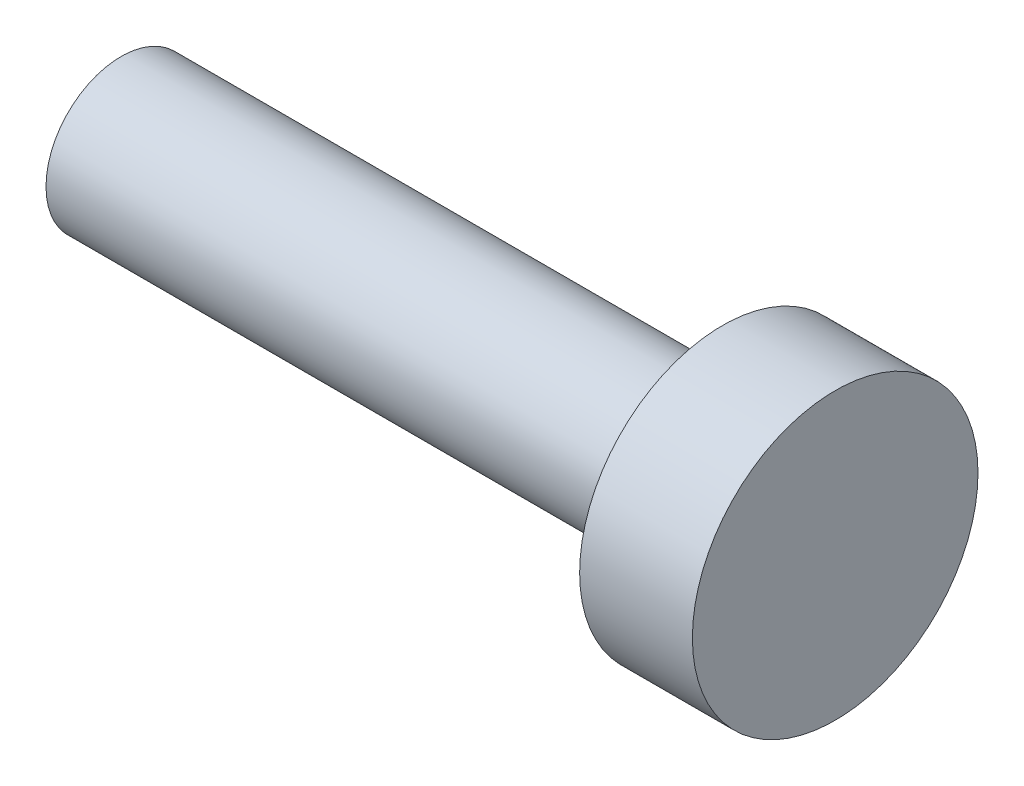
ISO-10303-21;
HEADER;
FILE_DESCRIPTION(('STEP AP214'),'2;1');
FILE_NAME('part.step','',(''),(''),'','','');
FILE_SCHEMA(('AUTOMOTIVE_DESIGN { 1 0 10303 214 1 1 1 1 }'));
ENDSEC;
DATA;
#1=APPLICATION_CONTEXT('core data for automotive mechanical design processes');
#2=APPLICATION_PROTOCOL_DEFINITION('international standard','automotive_design',2000,#1);
#3=PRODUCT_CONTEXT('',#1,'mechanical');
#4=PRODUCT('Part','Part','',(#3));
#5=PRODUCT_RELATED_PRODUCT_CATEGORY('part','',(#4));
#6=PRODUCT_DEFINITION_FORMATION('','',#4);
#7=PRODUCT_DEFINITION_CONTEXT('part definition',#1,'design');
#8=PRODUCT_DEFINITION('design','',#6,#7);
#9=PRODUCT_DEFINITION_SHAPE('','',#8);
#10=(LENGTH_UNIT() NAMED_UNIT(*) SI_UNIT(.MILLI.,.METRE.));
#11=(NAMED_UNIT(*) PLANE_ANGLE_UNIT() SI_UNIT($,.RADIAN.));
#12=(NAMED_UNIT(*) SI_UNIT($,.STERADIAN.) SOLID_ANGLE_UNIT());
#13=UNCERTAINTY_MEASURE_WITH_UNIT(LENGTH_MEASURE(1.E-05),#10,'distance_accuracy_value','');
#14=(GEOMETRIC_REPRESENTATION_CONTEXT(3) GLOBAL_UNCERTAINTY_ASSIGNED_CONTEXT((#13)) GLOBAL_UNIT_ASSIGNED_CONTEXT((#10,
#11,#12)) REPRESENTATION_CONTEXT('',''));
#15=CARTESIAN_POINT('',(0.,0.,0.));
#16=DIRECTION('',(0.,0.,1.));
#17=DIRECTION('',(1.,0.,0.));
#18=AXIS2_PLACEMENT_3D('',#15,#16,#17);
#19=CARTESIAN_POINT('',(241.,28.335135813417,145.771636741978));
#20=DIRECTION('',(-1.,0.,0.));
#21=DIRECTION('',(0.,0.,1.));
#22=AXIS2_PLACEMENT_3D('',#19,#20,#21);
#23=PLANE('',#22);
#24=CARTESIAN_POINT('',(241.,28.335135813417,145.771636741978));
#25=DIRECTION('',(-1.,0.,0.));
#26=DIRECTION('',(0.,0.,1.));
#27=AXIS2_PLACEMENT_3D('',#24,#25,#26);
#28=CIRCLE('',#27,5.);
#29=CARTESIAN_POINT('',(241.,28.335135813417,150.771636741978));
#30=VERTEX_POINT('',#29);
#31=EDGE_CURVE('E10',#30,#30,#28,.T.);
#32=ORIENTED_EDGE('',*,*,#31,.F.);
#33=EDGE_LOOP('',(#32));
#34=FACE_BOUND('',#33,.T.);
#35=CARTESIAN_POINT('',(241.,28.335135813417,145.771636741978));
#36=DIRECTION('',(1.,0.,0.));
#37=DIRECTION('',(0.,0.,-1.));
#38=AXIS2_PLACEMENT_3D('',#35,#36,#37);
#39=CIRCLE('',#38,9.5);
#40=CARTESIAN_POINT('',(241.,28.335135813417,136.271636741978));
#41=VERTEX_POINT('',#40);
#42=EDGE_CURVE('E33',#41,#41,#39,.T.);
#43=ORIENTED_EDGE('',*,*,#42,.F.);
#44=EDGE_LOOP('',(#43));
#45=FACE_BOUND('',#44,.T.);
#46=ADVANCED_FACE('F15',(#34,#45),#23,.T.);
#47=CARTESIAN_POINT('',(198.625,28.335135813417,145.771636741978));
#48=DIRECTION('',(1.,0.,0.));
#49=DIRECTION('',(0.,0.,1.));
#50=AXIS2_PLACEMENT_3D('',#47,#48,#49);
#51=CYLINDRICAL_SURFACE('',#50,9.5);
#52=CARTESIAN_POINT('',(248.5,28.335135813417,145.771636741978));
#53=DIRECTION('',(1.,0.,0.));
#54=DIRECTION('',(0.,0.,-1.));
#55=AXIS2_PLACEMENT_3D('',#52,#53,#54);
#56=CIRCLE('',#55,9.5);
#57=CARTESIAN_POINT('',(248.5,28.335135813417,136.271636741978));
#58=VERTEX_POINT('',#57);
#59=EDGE_CURVE('E36',#58,#58,#56,.T.);
#60=ORIENTED_EDGE('',*,*,#59,.F.);
#61=EDGE_LOOP('',(#60));
#62=FACE_BOUND('',#61,.T.);
#63=ORIENTED_EDGE('',*,*,#42,.T.);
#64=EDGE_LOOP('',(#63));
#65=FACE_BOUND('',#64,.T.);
#66=ADVANCED_FACE('F48',(#62,#65),#51,.T.);
#67=CARTESIAN_POINT('',(248.5,28.335135813417,145.771636741978));
#68=DIRECTION('',(1.,0.,0.));
#69=DIRECTION('',(0.,0.,1.));
#70=AXIS2_PLACEMENT_3D('',#67,#68,#69);
#71=PLANE('',#70);
#72=ORIENTED_EDGE('',*,*,#59,.T.);
#73=EDGE_LOOP('',(#72));
#74=FACE_BOUND('',#73,.T.);
#75=ADVANCED_FACE('F46',(#74),#71,.T.);
#76=CARTESIAN_POINT('',(201.,28.335135813417,145.771636741978));
#77=DIRECTION('',(-1.,0.,0.));
#78=DIRECTION('',(0.,0.,1.));
#79=AXIS2_PLACEMENT_3D('',#76,#77,#78);
#80=PLANE('',#79);
#81=CARTESIAN_POINT('',(201.,28.335135813417,145.771636741978));
#82=DIRECTION('',(-1.,0.,0.));
#83=DIRECTION('',(0.,-1.,0.));
#84=AXIS2_PLACEMENT_3D('',#81,#82,#83);
#85=CIRCLE('',#84,5.);
#86=CARTESIAN_POINT('',(201.,23.335135813417,145.771636741978));
#87=VERTEX_POINT('',#86);
#88=EDGE_CURVE('E23',#87,#87,#85,.T.);
#89=ORIENTED_EDGE('',*,*,#88,.T.);
#90=EDGE_LOOP('',(#89));
#91=FACE_BOUND('',#90,.T.);
#92=ADVANCED_FACE('F62',(#91),#80,.T.);
#93=CARTESIAN_POINT('',(201.,28.335135813417,145.771636741978));
#94=DIRECTION('',(-1.,0.,0.));
#95=DIRECTION('',(0.,1.,0.));
#96=AXIS2_PLACEMENT_3D('',#93,#94,#95);
#97=CYLINDRICAL_SURFACE('',#96,5.);
#98=ORIENTED_EDGE('',*,*,#88,.F.);
#99=EDGE_LOOP('',(#98));
#100=FACE_BOUND('',#99,.T.);
#101=ORIENTED_EDGE('',*,*,#31,.T.);
#102=EDGE_LOOP('',(#101));
#103=FACE_BOUND('',#102,.T.);
#104=ADVANCED_FACE('F17',(#100,#103),#97,.T.);
#105=CLOSED_SHELL('',(#46,#66,#75,#92,#104));
#106=MANIFOLD_SOLID_BREP('B1',#105);
#107=ADVANCED_BREP_SHAPE_REPRESENTATION('',(#18,#106),#14);
#108=SHAPE_DEFINITION_REPRESENTATION(#9,#107);
ENDSEC;
END-ISO-10303-21;
